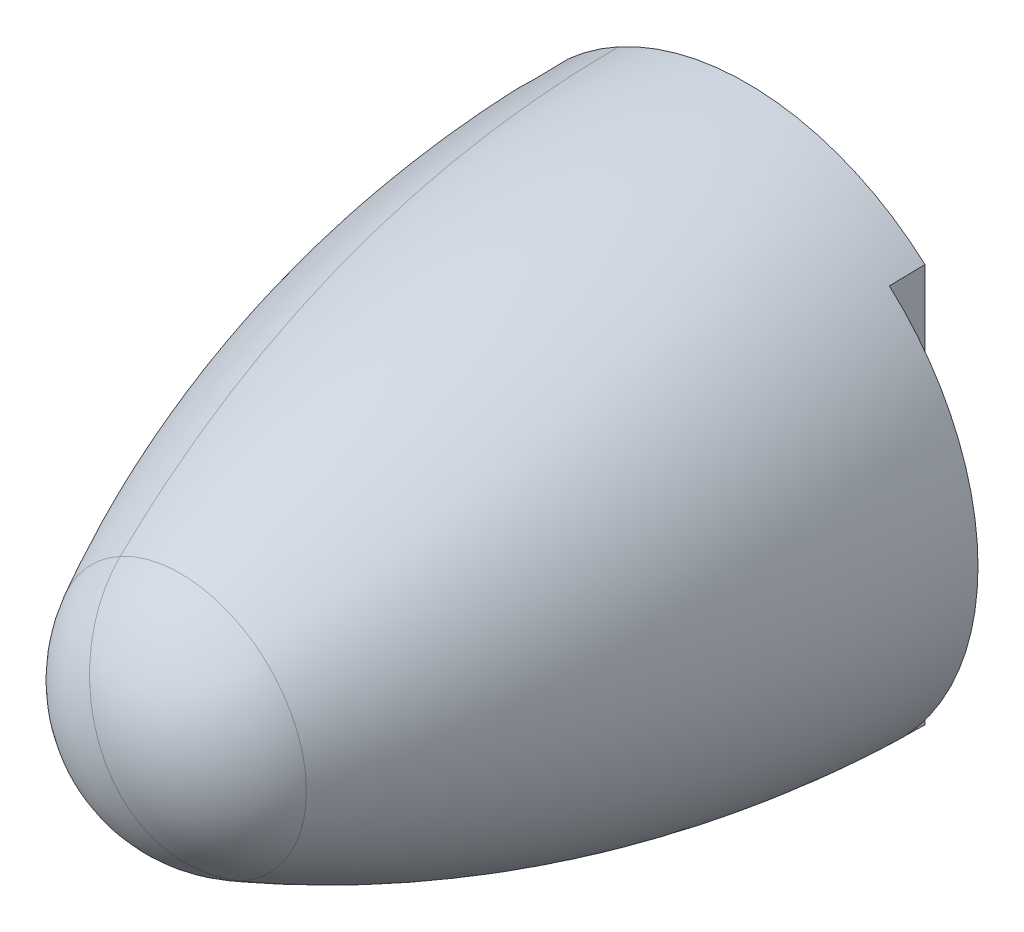
ISO-10303-21;
HEADER;
FILE_DESCRIPTION(('STEP AP214'),'2;1');
FILE_NAME('part.step','',(''),(''),'','','');
FILE_SCHEMA(('AUTOMOTIVE_DESIGN { 1 0 10303 214 1 1 1 1 }'));
ENDSEC;
DATA;
#1=APPLICATION_CONTEXT('core data for automotive mechanical design processes');
#2=APPLICATION_PROTOCOL_DEFINITION('international standard','automotive_design',2000,#1);
#3=PRODUCT_CONTEXT('',#1,'mechanical');
#4=PRODUCT('Part','Part','',(#3));
#5=PRODUCT_RELATED_PRODUCT_CATEGORY('part','',(#4));
#6=PRODUCT_DEFINITION_FORMATION('','',#4);
#7=PRODUCT_DEFINITION_CONTEXT('part definition',#1,'design');
#8=PRODUCT_DEFINITION('design','',#6,#7);
#9=PRODUCT_DEFINITION_SHAPE('','',#8);
#10=(LENGTH_UNIT() NAMED_UNIT(*) SI_UNIT(.MILLI.,.METRE.));
#11=(NAMED_UNIT(*) PLANE_ANGLE_UNIT() SI_UNIT($,.RADIAN.));
#12=(NAMED_UNIT(*) SI_UNIT($,.STERADIAN.) SOLID_ANGLE_UNIT());
#13=UNCERTAINTY_MEASURE_WITH_UNIT(LENGTH_MEASURE(1.E-05),#10,'distance_accuracy_value','');
#14=(GEOMETRIC_REPRESENTATION_CONTEXT(3) GLOBAL_UNCERTAINTY_ASSIGNED_CONTEXT((#13)) GLOBAL_UNIT_ASSIGNED_CONTEXT((#10,
#11,#12)) REPRESENTATION_CONTEXT('',''));
#15=CARTESIAN_POINT('',(0.,0.,0.));
#16=DIRECTION('',(0.,0.,1.));
#17=DIRECTION('',(1.,0.,0.));
#18=AXIS2_PLACEMENT_3D('',#15,#16,#17);
#19=CARTESIAN_POINT('',(1.19186438497E-13,1.07940101301E-13,1.567));
#20=DIRECTION('',(-1.11896950593106E-13,-1.01476130230119E-13,-1.));
#21=DIRECTION('',(-0.991778467700342,0.127966679280044,0.));
#22=AXIS2_PLACEMENT_3D('',#19,#20,#21);
#23=CONICAL_SURFACE('',#22,0.999999999999103,0.785398163397);
#24=DIRECTION('',(0.620544580563713,0.339005049420843,0.707106781186673));
#25=VECTOR('',#24,1.);
#26=CARTESIAN_POINT('',(-2.0333587959,-1.11082897295,0.25));
#27=LINE('',#26,#25);
#28=CARTESIAN_POINT('',(-2.25275443753,-1.23068535548,0.));
#29=VERTEX_POINT('',#28);
#30=CARTESIAN_POINT('',(-1.81396315543,-0.990972588295,0.5));
#31=VERTEX_POINT('',#30);
#32=EDGE_CURVE('E10',#29,#31,#27,.T.);
#33=ORIENTED_EDGE('',*,*,#32,.T.);
#34=CARTESIAN_POINT('',(0.,0.,0.5));
#35=DIRECTION('',(0.,0.,1.));
#36=DIRECTION('',(1.,0.,0.));
#37=AXIS2_PLACEMENT_3D('',#34,#35,#36);
#38=CIRCLE('',#37,2.067);
#39=CARTESIAN_POINT('',(1.81396315543,0.990972588295,0.5));
#40=VERTEX_POINT('',#39);
#41=EDGE_CURVE('E326',#31,#40,#38,.T.);
#42=ORIENTED_EDGE('',*,*,#41,.T.);
#43=DIRECTION('',(-0.620544580563713,-0.339005049420843,0.707106781186673));
#44=VECTOR('',#43,1.);
#45=CARTESIAN_POINT('',(2.0333587959,1.11082897295,0.25));
#46=LINE('',#45,#44);
#47=CARTESIAN_POINT('',(2.25275443637,1.2306853576,0.));
#48=VERTEX_POINT('',#47);
#49=EDGE_CURVE('E30',#48,#40,#46,.T.);
#50=ORIENTED_EDGE('',*,*,#49,.F.);
#51=CARTESIAN_POINT('',(0.,0.,0.));
#52=DIRECTION('',(0.,0.,1.));
#53=DIRECTION('',(1.,0.,0.));
#54=AXIS2_PLACEMENT_3D('',#51,#52,#53);
#55=CIRCLE('',#54,2.567);
#56=EDGE_CURVE('E194',#29,#48,#55,.T.);
#57=ORIENTED_EDGE('',*,*,#56,.F.);
#58=EDGE_LOOP('',(#33,#42,#50,#57));
#59=FACE_BOUND('',#58,.T.);
#60=ADVANCED_FACE('F15',(#59),#23,.F.);
#61=CARTESIAN_POINT('',(1.77691195091E-13,-2.10164330384E-13,1.567));
#62=DIRECTION('',(-1.66545789977354E-13,1.97168869830689E-13,-1.));
#63=DIRECTION('',(0.877582561890372,0.479425538604204,0.));
#64=AXIS2_PLACEMENT_3D('',#61,#62,#63);
#65=CONICAL_SURFACE('',#64,0.999999999999103,0.785398163397);
#66=ORIENTED_EDGE('',*,*,#49,.T.);
#67=CARTESIAN_POINT('',(0.,0.,0.5));
#68=DIRECTION('',(0.,0.,1.));
#69=DIRECTION('',(1.,0.,0.));
#70=AXIS2_PLACEMENT_3D('',#67,#68,#69);
#71=CIRCLE('',#70,2.067);
#72=EDGE_CURVE('E195',#40,#31,#71,.T.);
#73=ORIENTED_EDGE('',*,*,#72,.T.);
#74=ORIENTED_EDGE('',*,*,#32,.F.);
#75=CARTESIAN_POINT('',(0.,0.,0.));
#76=DIRECTION('',(0.,0.,1.));
#77=DIRECTION('',(1.,0.,0.));
#78=AXIS2_PLACEMENT_3D('',#75,#76,#77);
#79=CIRCLE('',#78,2.567);
#80=EDGE_CURVE('E190',#48,#29,#79,.T.);
#81=ORIENTED_EDGE('',*,*,#80,.F.);
#82=EDGE_LOOP('',(#66,#73,#74,#81));
#83=FACE_BOUND('',#82,.T.);
#84=ADVANCED_FACE('F261',(#83),#65,.F.);
#85=CARTESIAN_POINT('',(0.,0.,0.));
#86=DIRECTION('',(0.,0.,1.));
#87=DIRECTION('',(1.,0.,0.));
#88=AXIS2_PLACEMENT_3D('',#85,#86,#87);
#89=PLANE('',#88);
#90=ORIENTED_EDGE('',*,*,#80,.T.);
#91=ORIENTED_EDGE('',*,*,#56,.T.);
#92=EDGE_LOOP('',(#90,#91));
#93=FACE_BOUND('',#92,.T.);
#94=DIRECTION('',(0.,1.,0.));
#95=VECTOR('',#94,1.);
#96=CARTESIAN_POINT('',(-5.,0.,0.));
#97=LINE('',#96,#95);
#98=CARTESIAN_POINT('',(-5.,-5.59016994375,0.));
#99=VERTEX_POINT('',#98);
#100=CARTESIAN_POINT('',(-5.,5.59016994375,0.));
#101=VERTEX_POINT('',#100);
#102=EDGE_CURVE('E129',#99,#101,#97,.T.);
#103=ORIENTED_EDGE('',*,*,#102,.T.);
#104=CARTESIAN_POINT('',(0.,0.,0.));
#105=DIRECTION('',(0.,0.,1.));
#106=DIRECTION('',(1.,0.,0.));
#107=AXIS2_PLACEMENT_3D('',#104,#105,#106);
#108=CIRCLE('',#107,7.5);
#109=CARTESIAN_POINT('',(-3.59569153953,6.58186921418,0.));
#110=VERTEX_POINT('',#109);
#111=EDGE_CURVE('E315',#110,#101,#108,.T.);
#112=ORIENTED_EDGE('',*,*,#111,.F.);
#113=CARTESIAN_POINT('',(0.,0.,0.));
#114=DIRECTION('',(0.,0.,1.));
#115=DIRECTION('',(1.,0.,0.));
#116=AXIS2_PLACEMENT_3D('',#113,#114,#115);
#117=CIRCLE('',#116,7.5);
#118=CARTESIAN_POINT('',(5.,5.59016994375,0.));
#119=VERTEX_POINT('',#118);
#120=EDGE_CURVE('E101',#119,#110,#117,.T.);
#121=ORIENTED_EDGE('',*,*,#120,.F.);
#122=DIRECTION('',(0.,-1.,0.));
#123=VECTOR('',#122,1.);
#124=CARTESIAN_POINT('',(5.,0.,0.));
#125=LINE('',#124,#123);
#126=CARTESIAN_POINT('',(5.,-5.59016994375,0.));
#127=VERTEX_POINT('',#126);
#128=EDGE_CURVE('E130',#119,#127,#125,.T.);
#129=ORIENTED_EDGE('',*,*,#128,.T.);
#130=CARTESIAN_POINT('',(0.,0.,0.));
#131=DIRECTION('',(0.,0.,1.));
#132=DIRECTION('',(1.,0.,0.));
#133=AXIS2_PLACEMENT_3D('',#130,#131,#132);
#134=CIRCLE('',#133,7.5);
#135=CARTESIAN_POINT('',(3.59569153953,-6.58186921418,0.));
#136=VERTEX_POINT('',#135);
#137=EDGE_CURVE('E205',#136,#127,#134,.T.);
#138=ORIENTED_EDGE('',*,*,#137,.F.);
#139=CARTESIAN_POINT('',(0.,0.,0.));
#140=DIRECTION('',(0.,0.,1.));
#141=DIRECTION('',(1.,0.,0.));
#142=AXIS2_PLACEMENT_3D('',#139,#140,#141);
#143=CIRCLE('',#142,7.5);
#144=EDGE_CURVE('E139',#99,#136,#143,.T.);
#145=ORIENTED_EDGE('',*,*,#144,.F.);
#146=EDGE_LOOP('',(#103,#112,#121,#129,#138,#145));
#147=FACE_BOUND('',#146,.T.);
#148=ADVANCED_FACE('F269',(#93,#147),#89,.F.);
#149=CARTESIAN_POINT('',(0.,0.,0.1));
#150=DIRECTION('',(0.,0.,1.));
#151=DIRECTION('',(0.877582561890372,0.479425538604204,0.));
#152=AXIS2_PLACEMENT_3D('',#149,#150,#151);
#153=CYLINDRICAL_SURFACE('',#152,2.067);
#154=ORIENTED_EDGE('',*,*,#72,.F.);
#155=DIRECTION('',(0.,0.,-1.));
#156=VECTOR('',#155,1.);
#157=CARTESIAN_POINT('',(1.81396315543,0.990972588295,6.32486420542));
#158=LINE('',#157,#156);
#159=CARTESIAN_POINT('',(1.81396315543,0.990972588295,13.));
#160=VERTEX_POINT('',#159);
#161=EDGE_CURVE('E211',#160,#40,#158,.T.);
#162=ORIENTED_EDGE('',*,*,#161,.F.);
#163=CARTESIAN_POINT('',(0.,0.,13.));
#164=DIRECTION('',(0.,0.,1.));
#165=DIRECTION('',(1.,0.,0.));
#166=AXIS2_PLACEMENT_3D('',#163,#164,#165);
#167=CIRCLE('',#166,2.067);
#168=CARTESIAN_POINT('',(-1.81396315543,-0.990972588295,13.));
#169=VERTEX_POINT('',#168);
#170=EDGE_CURVE('E302',#160,#169,#167,.T.);
#171=ORIENTED_EDGE('',*,*,#170,.T.);
#172=DIRECTION('',(0.,0.,-1.));
#173=VECTOR('',#172,1.);
#174=CARTESIAN_POINT('',(-1.81396315543,-0.990972588295,6.32486420542));
#175=LINE('',#174,#173);
#176=EDGE_CURVE('E322',#169,#31,#175,.T.);
#177=ORIENTED_EDGE('',*,*,#176,.T.);
#178=EDGE_LOOP('',(#154,#162,#171,#177));
#179=FACE_BOUND('',#178,.T.);
#180=ADVANCED_FACE('F266',(#179),#153,.F.);
#181=CARTESIAN_POINT('',(0.,0.,0.1));
#182=DIRECTION('',(0.,0.,1.));
#183=DIRECTION('',(0.877582561890372,0.479425538604204,0.));
#184=AXIS2_PLACEMENT_3D('',#181,#182,#183);
#185=CYLINDRICAL_SURFACE('',#184,2.067);
#186=ORIENTED_EDGE('',*,*,#41,.F.);
#187=ORIENTED_EDGE('',*,*,#176,.F.);
#188=CARTESIAN_POINT('',(0.,0.,13.));
#189=DIRECTION('',(0.,0.,1.));
#190=DIRECTION('',(1.,0.,0.));
#191=AXIS2_PLACEMENT_3D('',#188,#189,#190);
#192=CIRCLE('',#191,2.067);
#193=EDGE_CURVE('E167',#169,#160,#192,.T.);
#194=ORIENTED_EDGE('',*,*,#193,.T.);
#195=ORIENTED_EDGE('',*,*,#161,.T.);
#196=EDGE_LOOP('',(#186,#187,#194,#195));
#197=FACE_BOUND('',#196,.T.);
#198=ADVANCED_FACE('F263',(#197),#185,.F.);
#199=CARTESIAN_POINT('',(-5.,10.,0.));
#200=DIRECTION('',(-1.,0.,0.));
#201=DIRECTION('',(0.,0.,1.));
#202=AXIS2_PLACEMENT_3D('',#199,#200,#201);
#203=PLANE('',#202);
#204=CARTESIAN_POINT('',(-5.,5.57027365202,1.));
#205=CARTESIAN_POINT('',(-5.,5.58354428604,0.666843033174));
#206=CARTESIAN_POINT('',(-5.,5.59016994375,0.333400143591));
#207=CARTESIAN_POINT('',(-5.,5.59016994375,0.));
#208=(BOUNDED_CURVE() B_SPLINE_CURVE(3,(#204,#205,#206,#207),.UNSPECIFIED.,.F.,
.F.) B_SPLINE_CURVE_WITH_KNOTS((4,4),(0.,1.41449701429),
.UNSPECIFIED.) CURVE() GEOMETRIC_REPRESENTATION_ITEM() RATIONAL_B_SPLINE_CURVE((1.,1.,1.,1.)) REPRESENTATION_ITEM(''));
#209=CARTESIAN_POINT('',(-5.,5.57027365202,1.));
#210=VERTEX_POINT('',#209);
#211=EDGE_CURVE('E143',#210,#101,#208,.T.);
#212=ORIENTED_EDGE('',*,*,#211,.T.);
#213=ORIENTED_EDGE('',*,*,#102,.F.);
#214=CARTESIAN_POINT('',(-5.,-5.57027365202,1.));
#215=CARTESIAN_POINT('',(-5.,-5.58354428604,0.666843033174));
#216=CARTESIAN_POINT('',(-5.,-5.59016994375,0.333400143591));
#217=CARTESIAN_POINT('',(-5.,-5.59016994375,0.));
#218=(BOUNDED_CURVE() B_SPLINE_CURVE(3,(#214,#215,#216,#217),.UNSPECIFIED.,.F.,
.F.) B_SPLINE_CURVE_WITH_KNOTS((4,4),(0.,1.41449701429),
.UNSPECIFIED.) CURVE() GEOMETRIC_REPRESENTATION_ITEM() RATIONAL_B_SPLINE_CURVE((1.,1.,1.,1.)) REPRESENTATION_ITEM(''));
#219=CARTESIAN_POINT('',(-5.,-5.57027365202,1.));
#220=VERTEX_POINT('',#219);
#221=EDGE_CURVE('E133',#220,#99,#218,.T.);
#222=ORIENTED_EDGE('',*,*,#221,.F.);
#223=DIRECTION('',(0.,1.,0.));
#224=VECTOR('',#223,1.);
#225=CARTESIAN_POINT('',(-5.,0.,1.));
#226=LINE('',#225,#224);
#227=EDGE_CURVE('E119',#220,#210,#226,.T.);
#228=ORIENTED_EDGE('',*,*,#227,.T.);
#229=EDGE_LOOP('',(#212,#213,#222,#228));
#230=FACE_BOUND('',#229,.T.);
#231=ADVANCED_FACE('F134',(#230),#203,.T.);
#232=CARTESIAN_POINT('',(0.,0.,1.));
#233=DIRECTION('',(0.,0.,1.));
#234=DIRECTION('',(1.,0.,0.));
#235=AXIS2_PLACEMENT_3D('',#232,#233,#234);
#236=PLANE('',#235);
#237=CARTESIAN_POINT('',(0.,0.,0.999999939220017));
#238=DIRECTION('',(0.,0.,1.));
#239=DIRECTION('',(-0.667986435771118,0.744173448616516,0.));
#240=AXIS2_PLACEMENT_3D('',#237,#238,#239);
#241=CIRCLE('',#240,7.48517988202087);
#242=EDGE_CURVE('E123',#220,#210,#241,.F.);
#243=ORIENTED_EDGE('',*,*,#242,.T.);
#244=ORIENTED_EDGE('',*,*,#227,.F.);
#245=EDGE_LOOP('',(#243,#244));
#246=FACE_BOUND('',#245,.T.);
#247=ADVANCED_FACE('F121',(#246),#236,.F.);
#248=CARTESIAN_POINT('',(5.,10.,0.));
#249=DIRECTION('',(-1.,0.,0.));
#250=DIRECTION('',(0.,0.,1.));
#251=AXIS2_PLACEMENT_3D('',#248,#249,#250);
#252=PLANE('',#251);
#253=ORIENTED_EDGE('',*,*,#128,.F.);
#254=CARTESIAN_POINT('',(5.,5.57027365202,1.));
#255=CARTESIAN_POINT('',(5.,5.58354428604,0.666843033174));
#256=CARTESIAN_POINT('',(5.,5.59016994375,0.333400143591));
#257=CARTESIAN_POINT('',(5.,5.59016994375,0.));
#258=(BOUNDED_CURVE() B_SPLINE_CURVE(3,(#254,#255,#256,#257),.UNSPECIFIED.,.F.,
.F.) B_SPLINE_CURVE_WITH_KNOTS((4,4),(0.,1.41449701429),
.UNSPECIFIED.) CURVE() GEOMETRIC_REPRESENTATION_ITEM() RATIONAL_B_SPLINE_CURVE((1.,1.,1.,1.)) REPRESENTATION_ITEM(''));
#259=CARTESIAN_POINT('',(5.,5.57027365202,1.));
#260=VERTEX_POINT('',#259);
#261=EDGE_CURVE('E206',#260,#119,#258,.T.);
#262=ORIENTED_EDGE('',*,*,#261,.F.);
#263=DIRECTION('',(0.,-1.,0.));
#264=VECTOR('',#263,1.);
#265=CARTESIAN_POINT('',(5.,0.,1.));
#266=LINE('',#265,#264);
#267=CARTESIAN_POINT('',(5.,-5.57027365202,1.));
#268=VERTEX_POINT('',#267);
#269=EDGE_CURVE('E87',#260,#268,#266,.T.);
#270=ORIENTED_EDGE('',*,*,#269,.T.);
#271=CARTESIAN_POINT('',(5.,-5.57027365202,1.));
#272=CARTESIAN_POINT('',(5.,-5.58354428604,0.666843033174));
#273=CARTESIAN_POINT('',(5.,-5.59016994375,0.333400143591));
#274=CARTESIAN_POINT('',(5.,-5.59016994375,0.));
#275=(BOUNDED_CURVE() B_SPLINE_CURVE(3,(#271,#272,#273,#274),.UNSPECIFIED.,.F.,
.F.) B_SPLINE_CURVE_WITH_KNOTS((4,4),(0.,1.41449701429),
.UNSPECIFIED.) CURVE() GEOMETRIC_REPRESENTATION_ITEM() RATIONAL_B_SPLINE_CURVE((1.,1.,1.,1.)) REPRESENTATION_ITEM(''));
#276=EDGE_CURVE('E351',#268,#127,#275,.T.);
#277=ORIENTED_EDGE('',*,*,#276,.T.);
#278=EDGE_LOOP('',(#253,#262,#270,#277));
#279=FACE_BOUND('',#278,.T.);
#280=ADVANCED_FACE('F256',(#279),#252,.F.);
#281=CARTESIAN_POINT('',(0.,0.,1.));
#282=DIRECTION('',(0.,0.,1.));
#283=DIRECTION('',(1.,0.,0.));
#284=AXIS2_PLACEMENT_3D('',#281,#282,#283);
#285=PLANE('',#284);
#286=CARTESIAN_POINT('',(0.,0.,0.999999939220017));
#287=DIRECTION('',(0.,0.,1.));
#288=DIRECTION('',(0.667986435771116,-0.744173448616518,0.));
#289=AXIS2_PLACEMENT_3D('',#286,#287,#288);
#290=CIRCLE('',#289,7.48517988202087);
#291=EDGE_CURVE('E240',#268,#260,#290,.T.);
#292=ORIENTED_EDGE('',*,*,#291,.F.);
#293=ORIENTED_EDGE('',*,*,#269,.F.);
#294=EDGE_LOOP('',(#292,#293));
#295=FACE_BOUND('',#294,.T.);
#296=ADVANCED_FACE('F226',(#295),#285,.F.);
#297=CARTESIAN_POINT('',(0.,7.5,0.));
#298=CARTESIAN_POINT('',(0.,7.5,4.13401494027));
#299=CARTESIAN_POINT('',(0.,6.82470030158,8.26867507539));
#300=CARTESIAN_POINT('',(0.,5.47483056013,12.2346926998));
#301=CARTESIAN_POINT('',(0.,3.52941176471,15.8823529412));
#302=(BOUNDED_CURVE() B_SPLINE_CURVE(4,(#297,#298,#299,#300,#301),.UNSPECIFIED.,.F.,
.F.) B_SPLINE_CURVE_WITH_KNOTS((5,5),(0.,16.5360597611),
.UNSPECIFIED.) CURVE() GEOMETRIC_REPRESENTATION_ITEM() RATIONAL_B_SPLINE_CURVE((1.,1.,1.,1.,1.)) REPRESENTATION_ITEM(''));
#303=CARTESIAN_POINT('',(0.,0.,9.));
#304=DIRECTION('',(0.,0.,-1.));
#305=AXIS1_PLACEMENT('',#303,#304);
#306=SURFACE_OF_REVOLUTION('',#302,#305);
#307=ORIENTED_EDGE('',*,*,#276,.F.);
#308=ORIENTED_EDGE('',*,*,#291,.T.);
#309=ORIENTED_EDGE('',*,*,#261,.T.);
#310=ORIENTED_EDGE('',*,*,#120,.T.);
#311=CARTESIAN_POINT('',(-3.59569153953,6.58186921418,0.));
#312=CARTESIAN_POINT('',(-3.59569153953,6.58186921418,4.13401494027));
#313=CARTESIAN_POINT('',(-3.2719356179,5.98923797479,8.26867507539));
#314=CARTESIAN_POINT('',(-2.62477359005,4.80461582887,12.2346926998));
#315=CARTESIAN_POINT('',(-1.69209013625,3.09735021844,15.8823529412));
#316=(BOUNDED_CURVE() B_SPLINE_CURVE(4,(#311,#312,#313,#314,#315),.UNSPECIFIED.,.F.,
.F.) B_SPLINE_CURVE_WITH_KNOTS((5,5),(0.,16.5360597611),
.UNSPECIFIED.) CURVE() GEOMETRIC_REPRESENTATION_ITEM() RATIONAL_B_SPLINE_CURVE((1.,1.,1.,1.,1.)) REPRESENTATION_ITEM(''));
#317=CARTESIAN_POINT('',(-1.69209013625,3.09735021844,15.8823529412));
#318=VERTEX_POINT('',#317);
#319=EDGE_CURVE('E310',#110,#318,#316,.T.);
#320=ORIENTED_EDGE('',*,*,#319,.T.);
#321=CARTESIAN_POINT('',(0.,0.,15.8823529412));
#322=DIRECTION('',(0.,0.,1.));
#323=DIRECTION('',(1.,0.,0.));
#324=AXIS2_PLACEMENT_3D('',#321,#322,#323);
#325=CIRCLE('',#324,3.52941176471);
#326=CARTESIAN_POINT('',(1.69209013625,-3.09735021844,15.8823529412));
#327=VERTEX_POINT('',#326);
#328=EDGE_CURVE('E183',#327,#318,#325,.T.);
#329=ORIENTED_EDGE('',*,*,#328,.F.);
#330=CARTESIAN_POINT('',(3.59569153953,-6.58186921418,0.));
#331=CARTESIAN_POINT('',(3.59569153953,-6.58186921418,4.13401494027));
#332=CARTESIAN_POINT('',(3.2719356179,-5.98923797479,8.26867507539));
#333=CARTESIAN_POINT('',(2.62477359005,-4.80461582887,12.2346926998));
#334=CARTESIAN_POINT('',(1.69209013625,-3.09735021844,15.8823529412));
#335=(BOUNDED_CURVE() B_SPLINE_CURVE(4,(#330,#331,#332,#333,#334),.UNSPECIFIED.,.F.,
.F.) B_SPLINE_CURVE_WITH_KNOTS((5,5),(0.,16.5360597611),
.UNSPECIFIED.) CURVE() GEOMETRIC_REPRESENTATION_ITEM() RATIONAL_B_SPLINE_CURVE((1.,1.,1.,1.,1.)) REPRESENTATION_ITEM(''));
#336=EDGE_CURVE('E316',#136,#327,#335,.T.);
#337=ORIENTED_EDGE('',*,*,#336,.F.);
#338=ORIENTED_EDGE('',*,*,#137,.T.);
#339=EDGE_LOOP('',(#307,#308,#309,#310,#320,#329,#337,#338));
#340=FACE_BOUND('',#339,.T.);
#341=ADVANCED_FACE('F222',(#340),#306,.F.);
#342=CARTESIAN_POINT('',(0.,7.5,0.));
#343=CARTESIAN_POINT('',(0.,7.5,4.13401494027));
#344=CARTESIAN_POINT('',(0.,6.82470030158,8.26867507539));
#345=CARTESIAN_POINT('',(0.,5.47483056013,12.2346926998));
#346=CARTESIAN_POINT('',(0.,3.52941176471,15.8823529412));
#347=(BOUNDED_CURVE() B_SPLINE_CURVE(4,(#342,#343,#344,#345,#346),.UNSPECIFIED.,.F.,
.F.) B_SPLINE_CURVE_WITH_KNOTS((5,5),(0.,16.5360597611),
.UNSPECIFIED.) CURVE() GEOMETRIC_REPRESENTATION_ITEM() RATIONAL_B_SPLINE_CURVE((1.,1.,1.,1.,1.)) REPRESENTATION_ITEM(''));
#348=CARTESIAN_POINT('',(0.,0.,9.));
#349=DIRECTION('',(0.,0.,-1.));
#350=AXIS1_PLACEMENT('',#348,#349);
#351=SURFACE_OF_REVOLUTION('',#347,#350);
#352=ORIENTED_EDGE('',*,*,#211,.F.);
#353=ORIENTED_EDGE('',*,*,#242,.F.);
#354=ORIENTED_EDGE('',*,*,#221,.T.);
#355=ORIENTED_EDGE('',*,*,#144,.T.);
#356=ORIENTED_EDGE('',*,*,#336,.T.);
#357=CARTESIAN_POINT('',(0.,0.,15.8823529412));
#358=DIRECTION('',(0.,0.,1.));
#359=DIRECTION('',(1.,0.,0.));
#360=AXIS2_PLACEMENT_3D('',#357,#358,#359);
#361=CIRCLE('',#360,3.52941176471);
#362=EDGE_CURVE('E173',#318,#327,#361,.T.);
#363=ORIENTED_EDGE('',*,*,#362,.F.);
#364=ORIENTED_EDGE('',*,*,#319,.F.);
#365=ORIENTED_EDGE('',*,*,#111,.T.);
#366=EDGE_LOOP('',(#352,#353,#354,#355,#356,#363,#364,#365));
#367=FACE_BOUND('',#366,.T.);
#368=ADVANCED_FACE('F17',(#367),#351,.F.);
#369=CARTESIAN_POINT('',(0.,0.,13.1933830064));
#370=DIRECTION('',(0.,0.,-1.));
#371=DIRECTION('',(0.877582561890372,0.479425538604204,0.));
#372=AXIS2_PLACEMENT_3D('',#369,#370,#371);
#373=CONICAL_SURFACE('',#372,1.73205080758248,1.0471975512);
#374=DIRECTION('',(0.760008792515256,0.41519469565414,-0.500000000000169));
#375=VECTOR('',#374,1.);
#376=CARTESIAN_POINT('',(0.906981577714,0.495486294147,13.5966915032));
#377=LINE('',#376,#375);
#378=CARTESIAN_POINT('',(0.,0.,14.1933830064));
#379=VERTEX_POINT('',#378);
#380=EDGE_CURVE('E303',#379,#160,#377,.T.);
#381=ORIENTED_EDGE('',*,*,#380,.T.);
#382=ORIENTED_EDGE('',*,*,#193,.F.);
#383=DIRECTION('',(-0.760008792515256,-0.41519469565414,-0.500000000000169));
#384=VECTOR('',#383,1.);
#385=CARTESIAN_POINT('',(-0.906981577714,-0.495486294147,13.5966915032));
#386=LINE('',#385,#384);
#387=EDGE_CURVE('E300',#379,#169,#386,.T.);
#388=ORIENTED_EDGE('',*,*,#387,.F.);
#389=EDGE_LOOP('',(#381,#382,#388));
#390=FACE_BOUND('',#389,.T.);
#391=ADVANCED_FACE('F270',(#390),#373,.F.);
#392=CARTESIAN_POINT('',(0.,0.,14.));
#393=DIRECTION('',(0.,0.,1.));
#394=DIRECTION('',(-0.479425538604204,0.877582561890372,0.));
#395=AXIS2_PLACEMENT_3D('',#392,#393,#394);
#396=SPHERICAL_SURFACE('',#395,4.);
#397=CARTESIAN_POINT('',(0.,0.,14.));
#398=DIRECTION('',(-0.877582561890372,-0.479425538604204,0.));
#399=DIRECTION('',(0.479425538604204,-0.877582561890372,0.));
#400=AXIS2_PLACEMENT_3D('',#397,#398,#399);
#401=CIRCLE('',#400,4.);
#402=CARTESIAN_POINT('',(0.,0.,18.));
#403=VERTEX_POINT('',#402);
#404=EDGE_CURVE('E189',#327,#403,#401,.T.);
#405=ORIENTED_EDGE('',*,*,#404,.T.);
#406=CARTESIAN_POINT('',(0.,0.,14.));
#407=DIRECTION('',(0.877582561890372,0.479425538604204,0.));
#408=DIRECTION('',(0.479425538604204,-0.877582561890372,0.));
#409=AXIS2_PLACEMENT_3D('',#406,#407,#408);
#410=CIRCLE('',#409,4.);
#411=EDGE_CURVE('E202',#318,#403,#410,.T.);
#412=ORIENTED_EDGE('',*,*,#411,.F.);
#413=ORIENTED_EDGE('',*,*,#362,.T.);
#414=EDGE_LOOP('',(#405,#412,#413));
#415=FACE_BOUND('',#414,.T.);
#416=ADVANCED_FACE('F227',(#415),#396,.T.);
#417=CARTESIAN_POINT('',(0.,0.,14.));
#418=DIRECTION('',(0.,0.,1.));
#419=DIRECTION('',(-0.479425538604204,0.877582561890372,0.));
#420=AXIS2_PLACEMENT_3D('',#417,#418,#419);
#421=SPHERICAL_SURFACE('',#420,4.);
#422=ORIENTED_EDGE('',*,*,#411,.T.);
#423=ORIENTED_EDGE('',*,*,#404,.F.);
#424=ORIENTED_EDGE('',*,*,#328,.T.);
#425=EDGE_LOOP('',(#422,#423,#424));
#426=FACE_BOUND('',#425,.T.);
#427=ADVANCED_FACE('F257',(#426),#421,.T.);
#428=CARTESIAN_POINT('',(0.,0.,13.1933830064));
#429=DIRECTION('',(0.,0.,-1.));
#430=DIRECTION('',(0.877582561890372,0.479425538604204,0.));
#431=AXIS2_PLACEMENT_3D('',#428,#429,#430);
#432=CONICAL_SURFACE('',#431,1.73205080758248,1.0471975512);
#433=ORIENTED_EDGE('',*,*,#387,.T.);
#434=ORIENTED_EDGE('',*,*,#170,.F.);
#435=ORIENTED_EDGE('',*,*,#380,.F.);
#436=EDGE_LOOP('',(#433,#434,#435));
#437=FACE_BOUND('',#436,.T.);
#438=ADVANCED_FACE('F290',(#437),#432,.F.);
#439=CLOSED_SHELL('',(#60,#84,#148,#180,#198,#231,#247,#280,#296,#341,#368,#391,#416,#427,#438));
#440=MANIFOLD_SOLID_BREP('B1',#439);
#441=ADVANCED_BREP_SHAPE_REPRESENTATION('',(#18,#440),#14);
#442=SHAPE_DEFINITION_REPRESENTATION(#9,#441);
ENDSEC;
END-ISO-10303-21;
